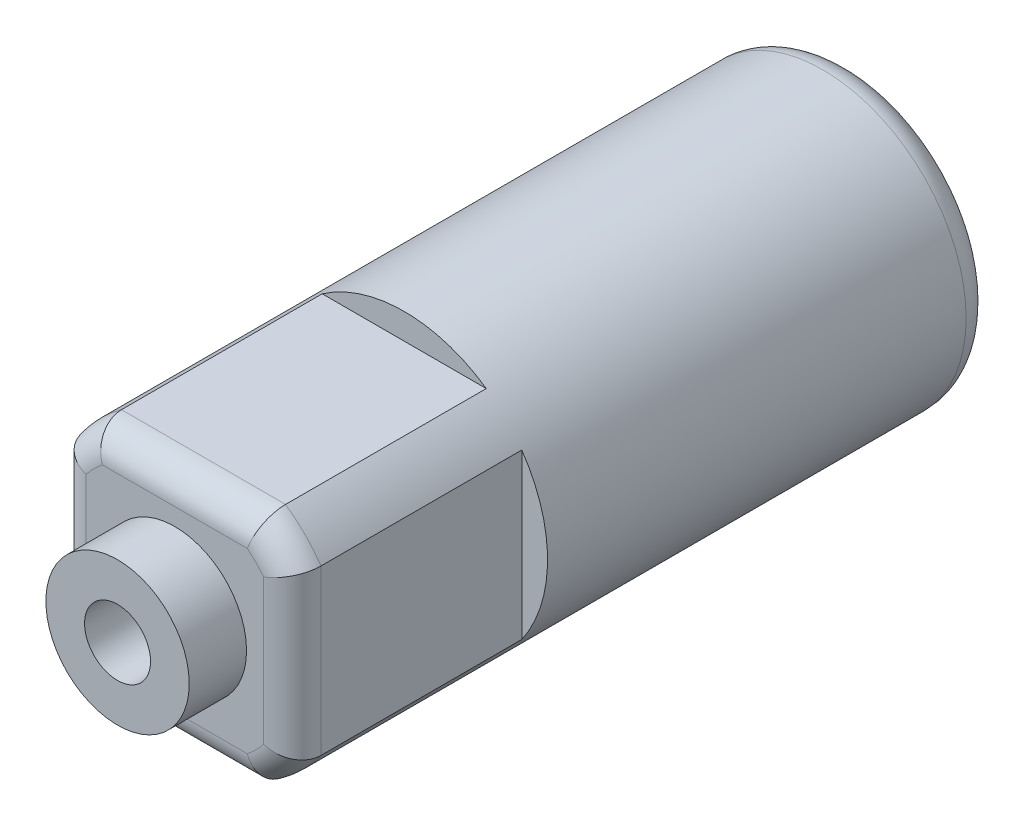
ISO-10303-21;
HEADER;
FILE_DESCRIPTION(('STEP AP214'),'2;1');
FILE_NAME('part.step','',(''),(''),'','','');
FILE_SCHEMA(('AUTOMOTIVE_DESIGN { 1 0 10303 214 1 1 1 1 }'));
ENDSEC;
DATA;
#1=APPLICATION_CONTEXT('core data for automotive mechanical design processes');
#2=APPLICATION_PROTOCOL_DEFINITION('international standard','automotive_design',2000,#1);
#3=PRODUCT_CONTEXT('',#1,'mechanical');
#4=PRODUCT('Part','Part','',(#3));
#5=PRODUCT_RELATED_PRODUCT_CATEGORY('part','',(#4));
#6=PRODUCT_DEFINITION_FORMATION('','',#4);
#7=PRODUCT_DEFINITION_CONTEXT('part definition',#1,'design');
#8=PRODUCT_DEFINITION('design','',#6,#7);
#9=PRODUCT_DEFINITION_SHAPE('','',#8);
#10=(LENGTH_UNIT() NAMED_UNIT(*) SI_UNIT(.MILLI.,.METRE.));
#11=(NAMED_UNIT(*) PLANE_ANGLE_UNIT() SI_UNIT($,.RADIAN.));
#12=(NAMED_UNIT(*) SI_UNIT($,.STERADIAN.) SOLID_ANGLE_UNIT());
#13=UNCERTAINTY_MEASURE_WITH_UNIT(LENGTH_MEASURE(1.E-05),#10,'distance_accuracy_value','');
#14=(GEOMETRIC_REPRESENTATION_CONTEXT(3) GLOBAL_UNCERTAINTY_ASSIGNED_CONTEXT((#13)) GLOBAL_UNIT_ASSIGNED_CONTEXT((#10,
#11,#12)) REPRESENTATION_CONTEXT('',''));
#15=CARTESIAN_POINT('',(0.,0.,0.));
#16=DIRECTION('',(0.,0.,1.));
#17=DIRECTION('',(1.,0.,0.));
#18=AXIS2_PLACEMENT_3D('',#15,#16,#17);
#19=CARTESIAN_POINT('',(0.,0.,23.6));
#20=DIRECTION('',(0.,0.,-1.));
#21=DIRECTION('',(-1.,0.,0.));
#22=AXIS2_PLACEMENT_3D('',#19,#20,#21);
#23=CYLINDRICAL_SURFACE('',#22,5.);
#24=CARTESIAN_POINT('',(0.,0.,1.));
#25=DIRECTION('',(0.,0.,1.));
#26=DIRECTION('',(1.,0.,0.));
#27=AXIS2_PLACEMENT_3D('',#24,#25,#26);
#28=CIRCLE('',#27,5.);
#29=CARTESIAN_POINT('',(5.,0.,1.));
#30=VERTEX_POINT('',#29);
#31=EDGE_CURVE('E183',#30,#30,#28,.T.);
#32=ORIENTED_EDGE('',*,*,#31,.T.);
#33=EDGE_LOOP('',(#32));
#34=FACE_BOUND('',#33,.T.);
#35=DIRECTION('',(0.,0.,-1.));
#36=VECTOR('',#35,1.);
#37=CARTESIAN_POINT('',(4.1,-2.86181760425084,23.6));
#38=LINE('',#37,#36);
#39=CARTESIAN_POINT('',(4.1,-2.86181760425084,15.6));
#40=VERTEX_POINT('',#39);
#41=CARTESIAN_POINT('',(4.1,-2.86181760425084,22.6));
#42=VERTEX_POINT('',#41);
#43=EDGE_CURVE('E137',#40,#42,#38,.F.);
#44=ORIENTED_EDGE('',*,*,#43,.T.);
#45=CARTESIAN_POINT('',(0.,0.,22.6));
#46=DIRECTION('',(0.,0.,1.));
#47=DIRECTION('',(1.,0.,0.));
#48=AXIS2_PLACEMENT_3D('',#45,#46,#47);
#49=CIRCLE('',#48,5.);
#50=CARTESIAN_POINT('',(2.86181760425084,-4.1,22.6));
#51=VERTEX_POINT('',#50);
#52=EDGE_CURVE('E134',#42,#51,#49,.F.);
#53=ORIENTED_EDGE('',*,*,#52,.T.);
#54=DIRECTION('',(0.,0.,-1.));
#55=VECTOR('',#54,1.);
#56=CARTESIAN_POINT('',(2.86181760425084,-4.1,23.6));
#57=LINE('',#56,#55);
#58=CARTESIAN_POINT('',(2.86181760425084,-4.1,15.6));
#59=VERTEX_POINT('',#58);
#60=EDGE_CURVE('E128',#51,#59,#57,.T.);
#61=ORIENTED_EDGE('',*,*,#60,.T.);
#62=CARTESIAN_POINT('',(0.,0.,15.6));
#63=DIRECTION('',(0.,0.,-1.));
#64=DIRECTION('',(-1.,0.,0.));
#65=AXIS2_PLACEMENT_3D('',#62,#63,#64);
#66=CIRCLE('',#65,5.);
#67=CARTESIAN_POINT('',(-2.86181760425084,-4.1,15.6));
#68=VERTEX_POINT('',#67);
#69=EDGE_CURVE('E132',#59,#68,#66,.T.);
#70=ORIENTED_EDGE('',*,*,#69,.T.);
#71=DIRECTION('',(0.,0.,-1.));
#72=VECTOR('',#71,1.);
#73=CARTESIAN_POINT('',(-2.86181760425084,-4.1,23.6));
#74=LINE('',#73,#72);
#75=CARTESIAN_POINT('',(-2.86181760425084,-4.1,22.6));
#76=VERTEX_POINT('',#75);
#77=EDGE_CURVE('E138',#68,#76,#74,.F.);
#78=ORIENTED_EDGE('',*,*,#77,.T.);
#79=CARTESIAN_POINT('',(0.,0.,22.6));
#80=DIRECTION('',(0.,0.,1.));
#81=DIRECTION('',(1.,0.,0.));
#82=AXIS2_PLACEMENT_3D('',#79,#80,#81);
#83=CIRCLE('',#82,5.);
#84=CARTESIAN_POINT('',(-4.1,-2.86181760425084,22.6));
#85=VERTEX_POINT('',#84);
#86=EDGE_CURVE('E180',#76,#85,#83,.F.);
#87=ORIENTED_EDGE('',*,*,#86,.T.);
#88=DIRECTION('',(0.,0.,-1.));
#89=VECTOR('',#88,1.);
#90=CARTESIAN_POINT('',(-4.1,-2.86181760425084,23.6));
#91=LINE('',#90,#89);
#92=CARTESIAN_POINT('',(-4.1,-2.86181760425084,15.6));
#93=VERTEX_POINT('',#92);
#94=EDGE_CURVE('E145',#85,#93,#91,.T.);
#95=ORIENTED_EDGE('',*,*,#94,.T.);
#96=CARTESIAN_POINT('',(-4.1,2.86181760425084,15.6));
#97=VERTEX_POINT('',#96);
#98=EDGE_CURVE('E147',#93,#97,#66,.T.);
#99=ORIENTED_EDGE('',*,*,#98,.T.);
#100=DIRECTION('',(0.,0.,-1.));
#101=VECTOR('',#100,1.);
#102=CARTESIAN_POINT('',(-4.1,2.86181760425084,23.6));
#103=LINE('',#102,#101);
#104=CARTESIAN_POINT('',(-4.1,2.86181760425084,22.6));
#105=VERTEX_POINT('',#104);
#106=EDGE_CURVE('E165',#97,#105,#103,.F.);
#107=ORIENTED_EDGE('',*,*,#106,.T.);
#108=CARTESIAN_POINT('',(0.,0.,22.6));
#109=DIRECTION('',(0.,0.,1.));
#110=DIRECTION('',(1.,0.,0.));
#111=AXIS2_PLACEMENT_3D('',#108,#109,#110);
#112=CIRCLE('',#111,5.);
#113=CARTESIAN_POINT('',(-2.86181760425084,4.1,22.6));
#114=VERTEX_POINT('',#113);
#115=EDGE_CURVE('E178',#105,#114,#112,.F.);
#116=ORIENTED_EDGE('',*,*,#115,.T.);
#117=DIRECTION('',(0.,0.,-1.));
#118=VECTOR('',#117,1.);
#119=CARTESIAN_POINT('',(-2.86181760425084,4.1,23.6));
#120=LINE('',#119,#118);
#121=CARTESIAN_POINT('',(-2.86181760425084,4.1,15.6));
#122=VERTEX_POINT('',#121);
#123=EDGE_CURVE('E163',#114,#122,#120,.T.);
#124=ORIENTED_EDGE('',*,*,#123,.T.);
#125=CARTESIAN_POINT('',(2.86181760425084,4.1,15.6));
#126=VERTEX_POINT('',#125);
#127=EDGE_CURVE('E314',#122,#126,#66,.T.);
#128=ORIENTED_EDGE('',*,*,#127,.T.);
#129=DIRECTION('',(0.,0.,-1.));
#130=VECTOR('',#129,1.);
#131=CARTESIAN_POINT('',(2.86181760425084,4.1,23.6));
#132=LINE('',#131,#130);
#133=CARTESIAN_POINT('',(2.86181760425084,4.1,22.6));
#134=VERTEX_POINT('',#133);
#135=EDGE_CURVE('E160',#126,#134,#132,.F.);
#136=ORIENTED_EDGE('',*,*,#135,.T.);
#137=CARTESIAN_POINT('',(0.,0.,22.6));
#138=DIRECTION('',(0.,0.,1.));
#139=DIRECTION('',(1.,0.,0.));
#140=AXIS2_PLACEMENT_3D('',#137,#138,#139);
#141=CIRCLE('',#140,5.);
#142=CARTESIAN_POINT('',(4.1,2.86181760425084,22.6));
#143=VERTEX_POINT('',#142);
#144=EDGE_CURVE('E176',#134,#143,#141,.F.);
#145=ORIENTED_EDGE('',*,*,#144,.T.);
#146=DIRECTION('',(0.,0.,-1.));
#147=VECTOR('',#146,1.);
#148=CARTESIAN_POINT('',(4.1,2.86181760425084,23.6));
#149=LINE('',#148,#147);
#150=CARTESIAN_POINT('',(4.1,2.86181760425084,15.6));
#151=VERTEX_POINT('',#150);
#152=EDGE_CURVE('E158',#143,#151,#149,.T.);
#153=ORIENTED_EDGE('',*,*,#152,.T.);
#154=EDGE_CURVE('E144',#151,#40,#66,.T.);
#155=ORIENTED_EDGE('',*,*,#154,.T.);
#156=EDGE_LOOP('',(#44,#53,#61,#70,#78,#87,#95,#99,#107,#116,#124,#128,#136,#145,#153,#155));
#157=FACE_BOUND('',#156,.T.);
#158=ADVANCED_FACE('F33',(#34,#157),#23,.T.);
#159=CARTESIAN_POINT('',(0.,0.,23.6));
#160=DIRECTION('',(0.,0.,1.));
#161=DIRECTION('',(1.,0.,0.));
#162=AXIS2_PLACEMENT_3D('',#159,#160,#161);
#163=PLANE('',#162);
#164=CARTESIAN_POINT('',(0.,0.,23.6));
#165=DIRECTION('',(0.,0.,1.));
#166=DIRECTION('',(1.,0.,0.));
#167=AXIS2_PLACEMENT_3D('',#164,#165,#166);
#168=CIRCLE('',#167,4.);
#169=CARTESIAN_POINT('',(-3.1,-2.52784493195291,23.6));
#170=VERTEX_POINT('',#169);
#171=CARTESIAN_POINT('',(-2.52784493195291,-3.1,23.6));
#172=VERTEX_POINT('',#171);
#173=EDGE_CURVE('E55',#170,#172,#168,.T.);
#174=ORIENTED_EDGE('',*,*,#173,.T.);
#175=DIRECTION('',(-1.,0.,0.));
#176=VECTOR('',#175,1.);
#177=CARTESIAN_POINT('',(2.86181760425084,-3.1,23.6));
#178=LINE('',#177,#176);
#179=CARTESIAN_POINT('',(2.52784493195291,-3.1,23.6));
#180=VERTEX_POINT('',#179);
#181=EDGE_CURVE('E202',#172,#180,#178,.F.);
#182=ORIENTED_EDGE('',*,*,#181,.T.);
#183=CARTESIAN_POINT('',(0.,0.,23.6));
#184=DIRECTION('',(0.,0.,1.));
#185=DIRECTION('',(1.,0.,0.));
#186=AXIS2_PLACEMENT_3D('',#183,#184,#185);
#187=CIRCLE('',#186,4.);
#188=CARTESIAN_POINT('',(3.1,-2.52784493195291,23.6));
#189=VERTEX_POINT('',#188);
#190=EDGE_CURVE('E193',#180,#189,#187,.T.);
#191=ORIENTED_EDGE('',*,*,#190,.T.);
#192=DIRECTION('',(0.,-1.,0.));
#193=VECTOR('',#192,1.);
#194=CARTESIAN_POINT('',(3.1,2.86181760425084,23.6));
#195=LINE('',#194,#193);
#196=CARTESIAN_POINT('',(3.1,2.52784493195291,23.6));
#197=VERTEX_POINT('',#196);
#198=EDGE_CURVE('E189',#189,#197,#195,.F.);
#199=ORIENTED_EDGE('',*,*,#198,.T.);
#200=CARTESIAN_POINT('',(0.,0.,23.6));
#201=DIRECTION('',(0.,0.,1.));
#202=DIRECTION('',(1.,0.,0.));
#203=AXIS2_PLACEMENT_3D('',#200,#201,#202);
#204=CIRCLE('',#203,4.);
#205=CARTESIAN_POINT('',(2.52784493195291,3.1,23.6));
#206=VERTEX_POINT('',#205);
#207=EDGE_CURVE('E191',#197,#206,#204,.T.);
#208=ORIENTED_EDGE('',*,*,#207,.T.);
#209=DIRECTION('',(1.,0.,0.));
#210=VECTOR('',#209,1.);
#211=CARTESIAN_POINT('',(-2.86181760425084,3.1,23.6));
#212=LINE('',#211,#210);
#213=CARTESIAN_POINT('',(-2.52784493195291,3.1,23.6));
#214=VERTEX_POINT('',#213);
#215=EDGE_CURVE('E196',#206,#214,#212,.F.);
#216=ORIENTED_EDGE('',*,*,#215,.T.);
#217=CARTESIAN_POINT('',(0.,0.,23.6));
#218=DIRECTION('',(0.,0.,1.));
#219=DIRECTION('',(1.,0.,0.));
#220=AXIS2_PLACEMENT_3D('',#217,#218,#219);
#221=CIRCLE('',#220,4.);
#222=CARTESIAN_POINT('',(-3.1,2.52784493195291,23.6));
#223=VERTEX_POINT('',#222);
#224=EDGE_CURVE('E198',#214,#223,#221,.T.);
#225=ORIENTED_EDGE('',*,*,#224,.T.);
#226=DIRECTION('',(0.,1.,0.));
#227=VECTOR('',#226,1.);
#228=CARTESIAN_POINT('',(-3.1,-2.86181760425084,23.6));
#229=LINE('',#228,#227);
#230=EDGE_CURVE('E60',#223,#170,#229,.F.);
#231=ORIENTED_EDGE('',*,*,#230,.T.);
#232=EDGE_LOOP('',(#174,#182,#191,#199,#208,#216,#225,#231));
#233=FACE_BOUND('',#232,.T.);
#234=CARTESIAN_POINT('',(0.,0.,23.6));
#235=DIRECTION('',(0.,0.,1.));
#236=DIRECTION('',(1.,0.,0.));
#237=AXIS2_PLACEMENT_3D('',#234,#235,#236);
#238=CIRCLE('',#237,2.5);
#239=CARTESIAN_POINT('',(2.5,0.,23.6));
#240=VERTEX_POINT('',#239);
#241=EDGE_CURVE('E173',#240,#240,#238,.T.);
#242=ORIENTED_EDGE('',*,*,#241,.F.);
#243=EDGE_LOOP('',(#242));
#244=FACE_BOUND('',#243,.T.);
#245=ADVANCED_FACE('F360',(#233,#244),#163,.T.);
#246=CARTESIAN_POINT('',(0.,0.,0.));
#247=DIRECTION('',(0.,0.,1.));
#248=DIRECTION('',(1.,0.,0.));
#249=AXIS2_PLACEMENT_3D('',#246,#247,#248);
#250=PLANE('',#249);
#251=CARTESIAN_POINT('',(0.,0.,0.));
#252=DIRECTION('',(0.,0.,1.));
#253=DIRECTION('',(1.,0.,0.));
#254=AXIS2_PLACEMENT_3D('',#251,#252,#253);
#255=CIRCLE('',#254,4.);
#256=CARTESIAN_POINT('',(4.,0.,0.));
#257=VERTEX_POINT('',#256);
#258=EDGE_CURVE('E186',#257,#257,#255,.F.);
#259=ORIENTED_EDGE('',*,*,#258,.T.);
#260=EDGE_LOOP('',(#259));
#261=FACE_BOUND('',#260,.T.);
#262=ADVANCED_FACE('F362',(#261),#250,.F.);
#263=CARTESIAN_POINT('',(4.1,-4.1,15.6));
#264=DIRECTION('',(0.,1.,0.));
#265=DIRECTION('',(0.,0.,1.));
#266=AXIS2_PLACEMENT_3D('',#263,#264,#265);
#267=PLANE('',#266);
#268=ORIENTED_EDGE('',*,*,#60,.F.);
#269=DIRECTION('',(-1.,0.,0.));
#270=VECTOR('',#269,1.);
#271=CARTESIAN_POINT('',(-2.86181760425084,-4.1,22.6));
#272=LINE('',#271,#270);
#273=EDGE_CURVE('E204',#51,#76,#272,.T.);
#274=ORIENTED_EDGE('',*,*,#273,.T.);
#275=ORIENTED_EDGE('',*,*,#77,.F.);
#276=DIRECTION('',(-1.,0.,0.));
#277=VECTOR('',#276,1.);
#278=CARTESIAN_POINT('',(4.1,-4.1,15.6));
#279=LINE('',#278,#277);
#280=EDGE_CURVE('E143',#59,#68,#279,.T.);
#281=ORIENTED_EDGE('',*,*,#280,.F.);
#282=EDGE_LOOP('',(#268,#274,#275,#281));
#283=FACE_BOUND('',#282,.T.);
#284=ADVANCED_FACE('F148',(#283),#267,.F.);
#285=CARTESIAN_POINT('',(0.,0.,15.6));
#286=DIRECTION('',(0.,0.,-1.));
#287=DIRECTION('',(-1.,0.,0.));
#288=AXIS2_PLACEMENT_3D('',#285,#286,#287);
#289=PLANE('',#288);
#290=ORIENTED_EDGE('',*,*,#280,.T.);
#291=ORIENTED_EDGE('',*,*,#69,.F.);
#292=EDGE_LOOP('',(#290,#291));
#293=FACE_BOUND('',#292,.T.);
#294=ADVANCED_FACE('F142',(#293),#289,.F.);
#295=CARTESIAN_POINT('',(4.1,-4.1,15.6));
#296=DIRECTION('',(-1.,0.,0.));
#297=DIRECTION('',(0.,0.,1.));
#298=AXIS2_PLACEMENT_3D('',#295,#296,#297);
#299=PLANE('',#298);
#300=ORIENTED_EDGE('',*,*,#152,.F.);
#301=DIRECTION('',(0.,-1.,0.));
#302=VECTOR('',#301,1.);
#303=CARTESIAN_POINT('',(4.1,-2.86181760425084,22.6));
#304=LINE('',#303,#302);
#305=EDGE_CURVE('E12',#143,#42,#304,.T.);
#306=ORIENTED_EDGE('',*,*,#305,.T.);
#307=ORIENTED_EDGE('',*,*,#43,.F.);
#308=DIRECTION('',(0.,-1.,0.));
#309=VECTOR('',#308,1.);
#310=CARTESIAN_POINT('',(4.1,-4.1,15.6));
#311=LINE('',#310,#309);
#312=EDGE_CURVE('E149',#151,#40,#311,.T.);
#313=ORIENTED_EDGE('',*,*,#312,.F.);
#314=EDGE_LOOP('',(#300,#306,#307,#313));
#315=FACE_BOUND('',#314,.T.);
#316=ADVANCED_FACE('F322',(#315),#299,.F.);
#317=ORIENTED_EDGE('',*,*,#312,.T.);
#318=ORIENTED_EDGE('',*,*,#154,.F.);
#319=EDGE_LOOP('',(#317,#318));
#320=FACE_BOUND('',#319,.T.);
#321=ADVANCED_FACE('F320',(#320),#289,.F.);
#322=CARTESIAN_POINT('',(4.1,4.1,15.6));
#323=DIRECTION('',(0.,-1.,0.));
#324=DIRECTION('',(0.,0.,-1.));
#325=AXIS2_PLACEMENT_3D('',#322,#323,#324);
#326=PLANE('',#325);
#327=ORIENTED_EDGE('',*,*,#123,.F.);
#328=DIRECTION('',(1.,0.,0.));
#329=VECTOR('',#328,1.);
#330=CARTESIAN_POINT('',(2.86181760425084,4.1,22.6));
#331=LINE('',#330,#329);
#332=EDGE_CURVE('E47',#114,#134,#331,.T.);
#333=ORIENTED_EDGE('',*,*,#332,.T.);
#334=ORIENTED_EDGE('',*,*,#135,.F.);
#335=DIRECTION('',(1.,0.,0.));
#336=VECTOR('',#335,1.);
#337=CARTESIAN_POINT('',(4.1,4.1,15.6));
#338=LINE('',#337,#336);
#339=EDGE_CURVE('E153',#122,#126,#338,.T.);
#340=ORIENTED_EDGE('',*,*,#339,.F.);
#341=EDGE_LOOP('',(#327,#333,#334,#340));
#342=FACE_BOUND('',#341,.T.);
#343=ADVANCED_FACE('F308',(#342),#326,.F.);
#344=ORIENTED_EDGE('',*,*,#339,.T.);
#345=ORIENTED_EDGE('',*,*,#127,.F.);
#346=EDGE_LOOP('',(#344,#345));
#347=FACE_BOUND('',#346,.T.);
#348=ADVANCED_FACE('F373',(#347),#289,.F.);
#349=DIRECTION('',(0.,1.,0.));
#350=VECTOR('',#349,1.);
#351=CARTESIAN_POINT('',(-4.1,-4.1,15.6));
#352=LINE('',#351,#350);
#353=EDGE_CURVE('E335',#93,#97,#352,.T.);
#354=ORIENTED_EDGE('',*,*,#353,.T.);
#355=ORIENTED_EDGE('',*,*,#98,.F.);
#356=EDGE_LOOP('',(#354,#355));
#357=FACE_BOUND('',#356,.T.);
#358=ADVANCED_FACE('F334',(#357),#289,.F.);
#359=CARTESIAN_POINT('',(-4.1,-4.1,15.6));
#360=DIRECTION('',(1.,0.,0.));
#361=DIRECTION('',(0.,0.,-1.));
#362=AXIS2_PLACEMENT_3D('',#359,#360,#361);
#363=PLANE('',#362);
#364=ORIENTED_EDGE('',*,*,#94,.F.);
#365=DIRECTION('',(0.,1.,0.));
#366=VECTOR('',#365,1.);
#367=CARTESIAN_POINT('',(-4.1,2.86181760425084,22.6));
#368=LINE('',#367,#366);
#369=EDGE_CURVE('E206',#85,#105,#368,.T.);
#370=ORIENTED_EDGE('',*,*,#369,.T.);
#371=ORIENTED_EDGE('',*,*,#106,.F.);
#372=ORIENTED_EDGE('',*,*,#353,.F.);
#373=EDGE_LOOP('',(#364,#370,#371,#372));
#374=FACE_BOUND('',#373,.T.);
#375=ADVANCED_FACE('F296',(#374),#363,.F.);
#376=CARTESIAN_POINT('',(0.,0.,25.6));
#377=DIRECTION('',(0.,0.,-1.));
#378=DIRECTION('',(-1.,0.,0.));
#379=AXIS2_PLACEMENT_3D('',#376,#377,#378);
#380=CYLINDRICAL_SURFACE('',#379,2.5);
#381=CARTESIAN_POINT('',(0.,0.,25.6));
#382=DIRECTION('',(0.,0.,1.));
#383=DIRECTION('',(1.,0.,0.));
#384=AXIS2_PLACEMENT_3D('',#381,#382,#383);
#385=CIRCLE('',#384,2.5);
#386=CARTESIAN_POINT('',(2.5,0.,25.6));
#387=VERTEX_POINT('',#386);
#388=EDGE_CURVE('E336',#387,#387,#385,.T.);
#389=ORIENTED_EDGE('',*,*,#388,.F.);
#390=EDGE_LOOP('',(#389));
#391=FACE_BOUND('',#390,.T.);
#392=ORIENTED_EDGE('',*,*,#241,.T.);
#393=EDGE_LOOP('',(#392));
#394=FACE_BOUND('',#393,.T.);
#395=ADVANCED_FACE('F351',(#391,#394),#380,.T.);
#396=CARTESIAN_POINT('',(0.,0.,25.6));
#397=DIRECTION('',(0.,0.,1.));
#398=DIRECTION('',(1.,0.,0.));
#399=AXIS2_PLACEMENT_3D('',#396,#397,#398);
#400=PLANE('',#399);
#401=CARTESIAN_POINT('',(0.,0.,25.6));
#402=DIRECTION('',(0.,0.,1.));
#403=DIRECTION('',(1.,0.,0.));
#404=AXIS2_PLACEMENT_3D('',#401,#402,#403);
#405=CIRCLE('',#404,1.15);
#406=CARTESIAN_POINT('',(1.15,0.,25.6));
#407=VERTEX_POINT('',#406);
#408=EDGE_CURVE('E286',#407,#407,#405,.T.);
#409=ORIENTED_EDGE('',*,*,#408,.F.);
#410=EDGE_LOOP('',(#409));
#411=FACE_BOUND('',#410,.T.);
#412=ORIENTED_EDGE('',*,*,#388,.T.);
#413=EDGE_LOOP('',(#412));
#414=FACE_BOUND('',#413,.T.);
#415=ADVANCED_FACE('F348',(#411,#414),#400,.T.);
#416=CARTESIAN_POINT('',(0.,0.,14.6));
#417=DIRECTION('',(0.,0.,1.));
#418=DIRECTION('',(1.,0.,0.));
#419=AXIS2_PLACEMENT_3D('',#416,#417,#418);
#420=CYLINDRICAL_SURFACE('',#419,1.15);
#421=CARTESIAN_POINT('',(0.,0.,15.6));
#422=DIRECTION('',(0.,0.,1.));
#423=DIRECTION('',(1.,0.,0.));
#424=AXIS2_PLACEMENT_3D('',#421,#422,#423);
#425=CIRCLE('',#424,1.15);
#426=CARTESIAN_POINT('',(1.15,0.,15.6));
#427=VERTEX_POINT('',#426);
#428=EDGE_CURVE('E172',#427,#427,#425,.F.);
#429=ORIENTED_EDGE('',*,*,#428,.T.);
#430=EDGE_LOOP('',(#429));
#431=FACE_BOUND('',#430,.T.);
#432=ORIENTED_EDGE('',*,*,#408,.T.);
#433=EDGE_LOOP('',(#432));
#434=FACE_BOUND('',#433,.T.);
#435=ADVANCED_FACE('F346',(#431,#434),#420,.F.);
#436=CARTESIAN_POINT('',(0.,0.,14.6));
#437=DIRECTION('',(0.,0.,1.));
#438=DIRECTION('',(1.,0.,0.));
#439=AXIS2_PLACEMENT_3D('',#436,#437,#438);
#440=PLANE('',#439);
#441=CARTESIAN_POINT('',(0.,0.,14.6));
#442=DIRECTION('',(0.,0.,1.));
#443=DIRECTION('',(1.,0.,0.));
#444=AXIS2_PLACEMENT_3D('',#441,#442,#443);
#445=CIRCLE('',#444,0.15);
#446=CARTESIAN_POINT('',(0.15,0.,14.6));
#447=VERTEX_POINT('',#446);
#448=EDGE_CURVE('E169',#447,#447,#445,.T.);
#449=ORIENTED_EDGE('',*,*,#448,.T.);
#450=EDGE_LOOP('',(#449));
#451=FACE_BOUND('',#450,.T.);
#452=ADVANCED_FACE('F379',(#451),#440,.T.);
#453=CARTESIAN_POINT('',(0.,0.,15.6));
#454=DIRECTION('',(0.,0.,1.));
#455=DIRECTION('',(1.,0.,0.));
#456=AXIS2_PLACEMENT_3D('',#453,#454,#455);
#457=DEGENERATE_TOROIDAL_SURFACE('',#456,0.15,1.,.T.);
#458=ORIENTED_EDGE('',*,*,#428,.F.);
#459=EDGE_LOOP('',(#458));
#460=FACE_BOUND('',#459,.T.);
#461=ORIENTED_EDGE('',*,*,#448,.F.);
#462=EDGE_LOOP('',(#461));
#463=FACE_BOUND('',#462,.T.);
#464=ADVANCED_FACE('F376',(#460,#463),#457,.F.);
#465=CARTESIAN_POINT('',(0.,0.,1.));
#466=DIRECTION('',(0.,0.,1.));
#467=DIRECTION('',(1.,0.,0.));
#468=AXIS2_PLACEMENT_3D('',#465,#466,#467);
#469=TOROIDAL_SURFACE('',#468,4.,1.);
#470=ORIENTED_EDGE('',*,*,#258,.F.);
#471=EDGE_LOOP('',(#470));
#472=FACE_BOUND('',#471,.T.);
#473=ORIENTED_EDGE('',*,*,#31,.F.);
#474=EDGE_LOOP('',(#473));
#475=FACE_BOUND('',#474,.T.);
#476=ADVANCED_FACE('F378',(#472,#475),#469,.T.);
#477=CARTESIAN_POINT('',(0.,0.,22.6));
#478=DIRECTION('',(0.,0.,1.));
#479=DIRECTION('',(1.,0.,0.));
#480=AXIS2_PLACEMENT_3D('',#477,#478,#479);
#481=TOROIDAL_SURFACE('',#480,4.,1.);
#482=CARTESIAN_POINT('',(-2.86181760425084,4.1,22.6));
#483=CARTESIAN_POINT('',(-2.86181754381553,4.10000046177195,22.6271677518521));
#484=CARTESIAN_POINT('',(-2.86146921460419,4.09889211822681,22.6543221749659));
#485=CARTESIAN_POINT('',(-2.86007961067067,4.09447481503274,22.7084299963281));
#486=CARTESIAN_POINT('',(-2.85903842762126,4.0911661465129,22.735383420694));
#487=CARTESIAN_POINT('',(-2.85488851549972,4.0779890499556,22.8155433674931));
#488=CARTESIAN_POINT('',(-2.85075337332471,4.06486931360432,22.8682017878048));
#489=CARTESIAN_POINT('',(-2.83985773348459,4.03042367778116,22.9704408958828));
#490=CARTESIAN_POINT('',(-2.83309706371142,4.00909724034603,23.0200213816378));
#491=CARTESIAN_POINT('',(-2.81712841407862,3.9589716318389,23.1148221684264));
#492=CARTESIAN_POINT('',(-2.80792016632315,3.93017164276911,23.1600419914316));
#493=CARTESIAN_POINT('',(-2.7871001770383,3.86545408433548,23.2457687310293));
#494=CARTESIAN_POINT('',(-2.77544787298001,3.82941689889108,23.2861752963155));
#495=CARTESIAN_POINT('',(-2.75012790373925,3.75169078565652,23.3603866845259));
#496=CARTESIAN_POINT('',(-2.73645960833823,3.71000009085389,23.3941894353242));
#497=CARTESIAN_POINT('',(-2.70678626889682,3.62025693578713,23.4558179978533));
#498=CARTESIAN_POINT('',(-2.69070515337854,3.57200594522239,23.4833176124662));
#499=CARTESIAN_POINT('',(-2.65706365808148,3.47205829395453,23.5298441453794));
#500=CARTESIAN_POINT('',(-2.63950324470725,3.42036155500264,23.5488708711953));
#501=CARTESIAN_POINT('',(-2.60680529786262,3.32512218303866,23.5753320987418));
#502=CARTESIAN_POINT('',(-2.59185359164907,3.28192965837449,23.5842945240204));
#503=CARTESIAN_POINT('',(-2.56147744886969,3.19496501116917,23.5964450751001));
#504=CARTESIAN_POINT('',(-2.54605395050984,3.15119412620187,23.5996439883005));
#505=CARTESIAN_POINT('',(-2.52962345276633,3.10499667130596,23.5999906598726));
#506=CARTESIAN_POINT('',(-2.52873437349047,3.10249818015746,23.6000000235239));
#507=CARTESIAN_POINT('',(-2.52784493195291,3.1,23.6));
#508=B_SPLINE_CURVE_WITH_KNOTS('',3,(#482,#483,#484,#485,#486,#487,#488,#489,#490,#491,#492,
#493,#494,#495,#496,#497,#498,#499,#500,#501,#502,#503,#504,#505,#506,#507),.UNSPECIFIED.,.F.,
.F.,(4,2,2,2,2,2,2,2,2,2,2,2,4),(0.,0.0814521164677968,0.162893457998911,0.325325403671738,
0.48776799884972,0.650228381256057,0.815635262282702,0.981093961138803,1.15379157910637,
1.32649312016438,1.46588963902794,1.60502498133526,1.61298084788939),.UNSPECIFIED.);
#509=EDGE_CURVE('E276',#114,#214,#508,.T.);
#510=ORIENTED_EDGE('',*,*,#509,.F.);
#511=ORIENTED_EDGE('',*,*,#115,.F.);
#512=CARTESIAN_POINT('',(-4.1,2.86181760425084,22.6));
#513=CARTESIAN_POINT('',(-4.10000046177195,2.86181754381553,22.6271677518521));
#514=CARTESIAN_POINT('',(-4.09889211822681,2.86146921460419,22.6543221749659));
#515=CARTESIAN_POINT('',(-4.09447481503274,2.86007961067067,22.7084299963281));
#516=CARTESIAN_POINT('',(-4.0911661465129,2.85903842762126,22.735383420694));
#517=CARTESIAN_POINT('',(-4.0779890499556,2.85488851549972,22.8155433674931));
#518=CARTESIAN_POINT('',(-4.06486931360432,2.85075337332471,22.8682017878048));
#519=CARTESIAN_POINT('',(-4.03042367778116,2.83985773348459,22.9704408958828));
#520=CARTESIAN_POINT('',(-4.00909724034603,2.83309706371142,23.0200213816378));
#521=CARTESIAN_POINT('',(-3.9589716318389,2.81712841407862,23.1148221684264));
#522=CARTESIAN_POINT('',(-3.93017164276911,2.80792016632315,23.1600419914316));
#523=CARTESIAN_POINT('',(-3.86545408433548,2.7871001770383,23.2457687310293));
#524=CARTESIAN_POINT('',(-3.82941689889108,2.77544787298001,23.2861752963155));
#525=CARTESIAN_POINT('',(-3.75169078565652,2.75012790373925,23.3603866845259));
#526=CARTESIAN_POINT('',(-3.71000009085389,2.73645960833823,23.3941894353242));
#527=CARTESIAN_POINT('',(-3.62025693578713,2.70678626889682,23.4558179978533));
#528=CARTESIAN_POINT('',(-3.57200594522239,2.69070515337854,23.4833176124662));
#529=CARTESIAN_POINT('',(-3.47205829395453,2.65706365808148,23.5298441453794));
#530=CARTESIAN_POINT('',(-3.42036155500264,2.63950324470725,23.5488708711953));
#531=CARTESIAN_POINT('',(-3.32512218303866,2.60680529786262,23.5753320987418));
#532=CARTESIAN_POINT('',(-3.28192965837449,2.59185359164907,23.5842945240204));
#533=CARTESIAN_POINT('',(-3.19496501116917,2.56147744886969,23.5964450751001));
#534=CARTESIAN_POINT('',(-3.15119412620187,2.54605395050984,23.5996439883005));
#535=CARTESIAN_POINT('',(-3.10499667130596,2.52962345276633,23.5999906598726));
#536=CARTESIAN_POINT('',(-3.10249818015746,2.52873437349047,23.6000000235239));
#537=CARTESIAN_POINT('',(-3.1,2.52784493195291,23.6));
#538=B_SPLINE_CURVE_WITH_KNOTS('',3,(#512,#513,#514,#515,#516,#517,#518,#519,#520,#521,#522,
#523,#524,#525,#526,#527,#528,#529,#530,#531,#532,#533,#534,#535,#536,#537),.UNSPECIFIED.,.F.,
.F.,(4,2,2,2,2,2,2,2,2,2,2,2,4),(0.,0.0814521164677968,0.162893457998911,0.325325403671738,
0.48776799884972,0.650228381256057,0.815635262282702,0.981093961138803,1.15379157910637,
1.32649312016438,1.46588963902794,1.60502498133526,1.61298084788939),.UNSPECIFIED.);
#539=EDGE_CURVE('E38',#223,#105,#538,.F.);
#540=ORIENTED_EDGE('',*,*,#539,.F.);
#541=ORIENTED_EDGE('',*,*,#224,.F.);
#542=EDGE_LOOP('',(#510,#511,#540,#541));
#543=FACE_BOUND('',#542,.T.);
#544=ADVANCED_FACE('F35',(#543),#481,.T.);
#545=CARTESIAN_POINT('',(-3.1,-4.1,22.6));
#546=DIRECTION('',(0.,-1.,0.));
#547=DIRECTION('',(0.,0.,-1.));
#548=AXIS2_PLACEMENT_3D('',#545,#546,#547);
#549=CYLINDRICAL_SURFACE('',#548,1.);
#550=ORIENTED_EDGE('',*,*,#539,.T.);
#551=ORIENTED_EDGE('',*,*,#369,.F.);
#552=CARTESIAN_POINT('',(-4.1,-2.86181760425084,22.6));
#553=CARTESIAN_POINT('',(-4.10000046177195,-2.86181754381553,22.6271677518521));
#554=CARTESIAN_POINT('',(-4.09889211822681,-2.86146921460419,22.6543221749659));
#555=CARTESIAN_POINT('',(-4.09447481503274,-2.86007961067067,22.7084299963281));
#556=CARTESIAN_POINT('',(-4.0911661465129,-2.85903842762126,22.735383420694));
#557=CARTESIAN_POINT('',(-4.0779890499556,-2.85488851549972,22.8155433674931));
#558=CARTESIAN_POINT('',(-4.06486931360432,-2.85075337332471,22.8682017878048));
#559=CARTESIAN_POINT('',(-4.03042367778116,-2.83985773348459,22.9704408958828));
#560=CARTESIAN_POINT('',(-4.00909724034603,-2.83309706371142,23.0200213816378));
#561=CARTESIAN_POINT('',(-3.9589716318389,-2.81712841407862,23.1148221684264));
#562=CARTESIAN_POINT('',(-3.93017164276911,-2.80792016632315,23.1600419914316));
#563=CARTESIAN_POINT('',(-3.86545408433548,-2.7871001770383,23.2457687310293));
#564=CARTESIAN_POINT('',(-3.82941689889108,-2.77544787298001,23.2861752963155));
#565=CARTESIAN_POINT('',(-3.75169078565652,-2.75012790373925,23.3603866845259));
#566=CARTESIAN_POINT('',(-3.71000009085389,-2.73645960833823,23.3941894353242));
#567=CARTESIAN_POINT('',(-3.62025693578713,-2.70678626889682,23.4558179978533));
#568=CARTESIAN_POINT('',(-3.57200594522239,-2.69070515337854,23.4833176124662));
#569=CARTESIAN_POINT('',(-3.47205829395453,-2.65706365808148,23.5298441453794));
#570=CARTESIAN_POINT('',(-3.42036155500264,-2.63950324470725,23.5488708711953));
#571=CARTESIAN_POINT('',(-3.32512218303866,-2.60680529786262,23.5753320987418));
#572=CARTESIAN_POINT('',(-3.28192965837449,-2.59185359164907,23.5842945240204));
#573=CARTESIAN_POINT('',(-3.19496501116917,-2.56147744886969,23.5964450751001));
#574=CARTESIAN_POINT('',(-3.15119412620187,-2.54605395050984,23.5996439883005));
#575=CARTESIAN_POINT('',(-3.10499667130596,-2.52962345276633,23.5999906598726));
#576=CARTESIAN_POINT('',(-3.10249818015746,-2.52873437349047,23.6000000235239));
#577=CARTESIAN_POINT('',(-3.1,-2.52784493195291,23.6));
#578=B_SPLINE_CURVE_WITH_KNOTS('',3,(#552,#553,#554,#555,#556,#557,#558,#559,#560,#561,#562,
#563,#564,#565,#566,#567,#568,#569,#570,#571,#572,#573,#574,#575,#576,#577),.UNSPECIFIED.,.F.,
.F.,(4,2,2,2,2,2,2,2,2,2,2,2,4),(0.,0.0814521164677968,0.162893457998911,0.325325403671738,
0.48776799884972,0.650228381256057,0.815635262282702,0.981093961138803,1.15379157910637,
1.32649312016438,1.46588963902794,1.60502498133526,1.61298084788939),.UNSPECIFIED.);
#579=EDGE_CURVE('E264',#170,#85,#578,.F.);
#580=ORIENTED_EDGE('',*,*,#579,.F.);
#581=ORIENTED_EDGE('',*,*,#230,.F.);
#582=EDGE_LOOP('',(#550,#551,#580,#581));
#583=FACE_BOUND('',#582,.T.);
#584=ADVANCED_FACE('F272',(#583),#549,.T.);
#585=CARTESIAN_POINT('',(4.1,3.1,22.6));
#586=DIRECTION('',(-1.,0.,0.));
#587=DIRECTION('',(0.,0.,1.));
#588=AXIS2_PLACEMENT_3D('',#585,#586,#587);
#589=CYLINDRICAL_SURFACE('',#588,1.);
#590=ORIENTED_EDGE('',*,*,#509,.T.);
#591=ORIENTED_EDGE('',*,*,#215,.F.);
#592=CARTESIAN_POINT('',(2.86181760425084,4.1,22.6));
#593=CARTESIAN_POINT('',(2.86181754381553,4.10000046177195,22.6271677518521));
#594=CARTESIAN_POINT('',(2.86146921460419,4.09889211822681,22.6543221749659));
#595=CARTESIAN_POINT('',(2.86007961067067,4.09447481503274,22.7084299963281));
#596=CARTESIAN_POINT('',(2.85903842762126,4.0911661465129,22.735383420694));
#597=CARTESIAN_POINT('',(2.85488851549972,4.0779890499556,22.8155433674931));
#598=CARTESIAN_POINT('',(2.85075337332471,4.06486931360432,22.8682017878048));
#599=CARTESIAN_POINT('',(2.83985773348459,4.03042367778116,22.9704408958828));
#600=CARTESIAN_POINT('',(2.83309706371142,4.00909724034603,23.0200213816378));
#601=CARTESIAN_POINT('',(2.81712841407862,3.9589716318389,23.1148221684264));
#602=CARTESIAN_POINT('',(2.80792016632315,3.93017164276911,23.1600419914316));
#603=CARTESIAN_POINT('',(2.7871001770383,3.86545408433548,23.2457687310293));
#604=CARTESIAN_POINT('',(2.77544787298001,3.82941689889108,23.2861752963155));
#605=CARTESIAN_POINT('',(2.75012790373925,3.75169078565652,23.3603866845259));
#606=CARTESIAN_POINT('',(2.73645960833823,3.71000009085389,23.3941894353242));
#607=CARTESIAN_POINT('',(2.70678626889682,3.62025693578713,23.4558179978533));
#608=CARTESIAN_POINT('',(2.69070515337854,3.57200594522239,23.4833176124662));
#609=CARTESIAN_POINT('',(2.65706365808148,3.47205829395453,23.5298441453794));
#610=CARTESIAN_POINT('',(2.63950324470725,3.42036155500264,23.5488708711953));
#611=CARTESIAN_POINT('',(2.60680529786262,3.32512218303866,23.5753320987418));
#612=CARTESIAN_POINT('',(2.59185359164907,3.28192965837449,23.5842945240204));
#613=CARTESIAN_POINT('',(2.56147744886969,3.19496501116917,23.5964450751001));
#614=CARTESIAN_POINT('',(2.54605395050984,3.15119412620187,23.5996439883005));
#615=CARTESIAN_POINT('',(2.52962345276633,3.10499667130596,23.5999906598726));
#616=CARTESIAN_POINT('',(2.52873437349047,3.10249818015746,23.6000000235239));
#617=CARTESIAN_POINT('',(2.52784493195291,3.1,23.6));
#618=B_SPLINE_CURVE_WITH_KNOTS('',3,(#592,#593,#594,#595,#596,#597,#598,#599,#600,#601,#602,
#603,#604,#605,#606,#607,#608,#609,#610,#611,#612,#613,#614,#615,#616,#617),.UNSPECIFIED.,.F.,
.F.,(4,2,2,2,2,2,2,2,2,2,2,2,4),(0.,0.0814521164677968,0.162893457998911,0.325325403671738,
0.48776799884972,0.650228381256057,0.815635262282702,0.981093961138803,1.15379157910637,
1.32649312016438,1.46588963902794,1.60502498133526,1.61298084788939),.UNSPECIFIED.);
#619=EDGE_CURVE('E257',#134,#206,#618,.T.);
#620=ORIENTED_EDGE('',*,*,#619,.F.);
#621=ORIENTED_EDGE('',*,*,#332,.F.);
#622=EDGE_LOOP('',(#590,#591,#620,#621));
#623=FACE_BOUND('',#622,.T.);
#624=ADVANCED_FACE('F269',(#623),#589,.T.);
#625=CARTESIAN_POINT('',(0.,0.,22.6));
#626=DIRECTION('',(0.,0.,1.));
#627=DIRECTION('',(1.,0.,0.));
#628=AXIS2_PLACEMENT_3D('',#625,#626,#627);
#629=TOROIDAL_SURFACE('',#628,4.,1.);
#630=ORIENTED_EDGE('',*,*,#579,.T.);
#631=ORIENTED_EDGE('',*,*,#86,.F.);
#632=CARTESIAN_POINT('',(-2.86181760425084,-4.1,22.6));
#633=CARTESIAN_POINT('',(-2.86181754381553,-4.10000046177195,22.6271677518521));
#634=CARTESIAN_POINT('',(-2.86146921460419,-4.09889211822681,22.6543221749659));
#635=CARTESIAN_POINT('',(-2.86007961067067,-4.09447481503274,22.7084299963281));
#636=CARTESIAN_POINT('',(-2.85903842762126,-4.0911661465129,22.735383420694));
#637=CARTESIAN_POINT('',(-2.85488851549972,-4.0779890499556,22.8155433674931));
#638=CARTESIAN_POINT('',(-2.85075337332471,-4.06486931360432,22.8682017878048));
#639=CARTESIAN_POINT('',(-2.83985773348459,-4.03042367778116,22.9704408958828));
#640=CARTESIAN_POINT('',(-2.83309706371142,-4.00909724034603,23.0200213816378));
#641=CARTESIAN_POINT('',(-2.81712841407862,-3.9589716318389,23.1148221684264));
#642=CARTESIAN_POINT('',(-2.80792016632315,-3.93017164276911,23.1600419914316));
#643=CARTESIAN_POINT('',(-2.7871001770383,-3.86545408433548,23.2457687310293));
#644=CARTESIAN_POINT('',(-2.77544787298001,-3.82941689889108,23.2861752963155));
#645=CARTESIAN_POINT('',(-2.75012790373925,-3.75169078565652,23.3603866845259));
#646=CARTESIAN_POINT('',(-2.73645960833823,-3.71000009085389,23.3941894353242));
#647=CARTESIAN_POINT('',(-2.70678626889682,-3.62025693578713,23.4558179978533));
#648=CARTESIAN_POINT('',(-2.69070515337854,-3.57200594522239,23.4833176124662));
#649=CARTESIAN_POINT('',(-2.65706365808148,-3.47205829395453,23.5298441453794));
#650=CARTESIAN_POINT('',(-2.63950324470725,-3.42036155500264,23.5488708711953));
#651=CARTESIAN_POINT('',(-2.60680529786262,-3.32512218303866,23.5753320987418));
#652=CARTESIAN_POINT('',(-2.59185359164907,-3.28192965837449,23.5842945240204));
#653=CARTESIAN_POINT('',(-2.56147744886969,-3.19496501116917,23.5964450751001));
#654=CARTESIAN_POINT('',(-2.54605395050984,-3.15119412620187,23.5996439883005));
#655=CARTESIAN_POINT('',(-2.52962345276633,-3.10499667130596,23.5999906598726));
#656=CARTESIAN_POINT('',(-2.52873437349047,-3.10249818015746,23.6000000235239));
#657=CARTESIAN_POINT('',(-2.52784493195291,-3.1,23.6));
#658=B_SPLINE_CURVE_WITH_KNOTS('',3,(#632,#633,#634,#635,#636,#637,#638,#639,#640,#641,#642,
#643,#644,#645,#646,#647,#648,#649,#650,#651,#652,#653,#654,#655,#656,#657),.UNSPECIFIED.,.F.,
.F.,(4,2,2,2,2,2,2,2,2,2,2,2,4),(0.,0.0814521164677968,0.162893457998911,0.325325403671738,
0.48776799884972,0.650228381256057,0.815635262282702,0.981093961138803,1.15379157910637,
1.32649312016438,1.46588963902794,1.60502498133526,1.61298084788939),.UNSPECIFIED.);
#659=EDGE_CURVE('E242',#172,#76,#658,.F.);
#660=ORIENTED_EDGE('',*,*,#659,.F.);
#661=ORIENTED_EDGE('',*,*,#173,.F.);
#662=EDGE_LOOP('',(#630,#631,#660,#661));
#663=FACE_BOUND('',#662,.T.);
#664=ADVANCED_FACE('F252',(#663),#629,.T.);
#665=CARTESIAN_POINT('',(0.,0.,22.6));
#666=DIRECTION('',(0.,0.,1.));
#667=DIRECTION('',(1.,0.,0.));
#668=AXIS2_PLACEMENT_3D('',#665,#666,#667);
#669=TOROIDAL_SURFACE('',#668,4.,1.);
#670=ORIENTED_EDGE('',*,*,#619,.T.);
#671=ORIENTED_EDGE('',*,*,#207,.F.);
#672=CARTESIAN_POINT('',(4.1,2.86181760425084,22.6));
#673=CARTESIAN_POINT('',(4.10000046177195,2.86181754381553,22.6271677518521));
#674=CARTESIAN_POINT('',(4.09889211822681,2.86146921460419,22.6543221749659));
#675=CARTESIAN_POINT('',(4.09447481503274,2.86007961067067,22.7084299963281));
#676=CARTESIAN_POINT('',(4.0911661465129,2.85903842762126,22.735383420694));
#677=CARTESIAN_POINT('',(4.0779890499556,2.85488851549972,22.8155433674931));
#678=CARTESIAN_POINT('',(4.06486931360432,2.85075337332471,22.8682017878048));
#679=CARTESIAN_POINT('',(4.03042367778116,2.83985773348459,22.9704408958828));
#680=CARTESIAN_POINT('',(4.00909724034603,2.83309706371142,23.0200213816378));
#681=CARTESIAN_POINT('',(3.9589716318389,2.81712841407862,23.1148221684264));
#682=CARTESIAN_POINT('',(3.93017164276911,2.80792016632315,23.1600419914316));
#683=CARTESIAN_POINT('',(3.86545408433548,2.7871001770383,23.2457687310293));
#684=CARTESIAN_POINT('',(3.82941689889108,2.77544787298001,23.2861752963155));
#685=CARTESIAN_POINT('',(3.75169078565652,2.75012790373925,23.3603866845259));
#686=CARTESIAN_POINT('',(3.71000009085389,2.73645960833823,23.3941894353242));
#687=CARTESIAN_POINT('',(3.62025693578713,2.70678626889682,23.4558179978533));
#688=CARTESIAN_POINT('',(3.57200594522239,2.69070515337854,23.4833176124662));
#689=CARTESIAN_POINT('',(3.47205829395453,2.65706365808148,23.5298441453794));
#690=CARTESIAN_POINT('',(3.42036155500264,2.63950324470725,23.5488708711953));
#691=CARTESIAN_POINT('',(3.32512218303866,2.60680529786262,23.5753320987418));
#692=CARTESIAN_POINT('',(3.28192965837449,2.59185359164907,23.5842945240204));
#693=CARTESIAN_POINT('',(3.19496501116917,2.56147744886969,23.5964450751001));
#694=CARTESIAN_POINT('',(3.15119412620187,2.54605395050984,23.5996439883005));
#695=CARTESIAN_POINT('',(3.10499667130596,2.52962345276633,23.5999906598726));
#696=CARTESIAN_POINT('',(3.10249818015746,2.52873437349047,23.6000000235239));
#697=CARTESIAN_POINT('',(3.1,2.52784493195291,23.6));
#698=B_SPLINE_CURVE_WITH_KNOTS('',3,(#672,#673,#674,#675,#676,#677,#678,#679,#680,#681,#682,
#683,#684,#685,#686,#687,#688,#689,#690,#691,#692,#693,#694,#695,#696,#697),.UNSPECIFIED.,.F.,
.F.,(4,2,2,2,2,2,2,2,2,2,2,2,4),(0.,0.0814521164677968,0.162893457998911,0.325325403671738,
0.48776799884972,0.650228381256057,0.815635262282702,0.981093961138803,1.15379157910637,
1.32649312016438,1.46588963902794,1.60502498133526,1.61298084788939),.UNSPECIFIED.);
#699=EDGE_CURVE('E235',#143,#197,#698,.T.);
#700=ORIENTED_EDGE('',*,*,#699,.F.);
#701=ORIENTED_EDGE('',*,*,#144,.F.);
#702=EDGE_LOOP('',(#670,#671,#700,#701));
#703=FACE_BOUND('',#702,.T.);
#704=ADVANCED_FACE('F249',(#703),#669,.T.);
#705=CARTESIAN_POINT('',(4.1,-3.1,22.6));
#706=DIRECTION('',(1.,0.,0.));
#707=DIRECTION('',(0.,0.,-1.));
#708=AXIS2_PLACEMENT_3D('',#705,#706,#707);
#709=CYLINDRICAL_SURFACE('',#708,1.);
#710=ORIENTED_EDGE('',*,*,#659,.T.);
#711=ORIENTED_EDGE('',*,*,#273,.F.);
#712=CARTESIAN_POINT('',(2.86181760425084,-4.1,22.6));
#713=CARTESIAN_POINT('',(2.86181754381553,-4.10000046177195,22.6271677518521));
#714=CARTESIAN_POINT('',(2.86146921460419,-4.09889211822681,22.6543221749659));
#715=CARTESIAN_POINT('',(2.86007961067067,-4.09447481503274,22.7084299963281));
#716=CARTESIAN_POINT('',(2.85903842762126,-4.0911661465129,22.735383420694));
#717=CARTESIAN_POINT('',(2.85488851549972,-4.0779890499556,22.8155433674931));
#718=CARTESIAN_POINT('',(2.85075337332471,-4.06486931360432,22.8682017878048));
#719=CARTESIAN_POINT('',(2.83985773348459,-4.03042367778116,22.9704408958828));
#720=CARTESIAN_POINT('',(2.83309706371142,-4.00909724034603,23.0200213816378));
#721=CARTESIAN_POINT('',(2.81712841407862,-3.9589716318389,23.1148221684264));
#722=CARTESIAN_POINT('',(2.80792016632315,-3.93017164276911,23.1600419914316));
#723=CARTESIAN_POINT('',(2.7871001770383,-3.86545408433548,23.2457687310293));
#724=CARTESIAN_POINT('',(2.77544787298001,-3.82941689889108,23.2861752963155));
#725=CARTESIAN_POINT('',(2.75012790373925,-3.75169078565652,23.3603866845259));
#726=CARTESIAN_POINT('',(2.73645960833823,-3.71000009085389,23.3941894353242));
#727=CARTESIAN_POINT('',(2.70678626889682,-3.62025693578713,23.4558179978533));
#728=CARTESIAN_POINT('',(2.69070515337854,-3.57200594522239,23.4833176124662));
#729=CARTESIAN_POINT('',(2.65706365808148,-3.47205829395453,23.5298441453794));
#730=CARTESIAN_POINT('',(2.63950324470725,-3.42036155500264,23.5488708711953));
#731=CARTESIAN_POINT('',(2.60680529786262,-3.32512218303866,23.5753320987418));
#732=CARTESIAN_POINT('',(2.59185359164907,-3.28192965837449,23.5842945240204));
#733=CARTESIAN_POINT('',(2.56147744886969,-3.19496501116917,23.5964450751001));
#734=CARTESIAN_POINT('',(2.54605395050984,-3.15119412620187,23.5996439883005));
#735=CARTESIAN_POINT('',(2.52962345276633,-3.10499667130596,23.5999906598726));
#736=CARTESIAN_POINT('',(2.52873437349047,-3.10249818015746,23.6000000235239));
#737=CARTESIAN_POINT('',(2.52784493195291,-3.1,23.6));
#738=B_SPLINE_CURVE_WITH_KNOTS('',3,(#712,#713,#714,#715,#716,#717,#718,#719,#720,#721,#722,
#723,#724,#725,#726,#727,#728,#729,#730,#731,#732,#733,#734,#735,#736,#737),.UNSPECIFIED.,.F.,
.F.,(4,2,2,2,2,2,2,2,2,2,2,2,4),(0.,0.0814521164677968,0.162893457998911,0.325325403671738,
0.48776799884972,0.650228381256057,0.815635262282702,0.981093961138803,1.15379157910637,
1.32649312016438,1.46588963902794,1.60502498133526,1.61298084788939),.UNSPECIFIED.);
#739=EDGE_CURVE('E217',#180,#51,#738,.F.);
#740=ORIENTED_EDGE('',*,*,#739,.F.);
#741=ORIENTED_EDGE('',*,*,#181,.F.);
#742=EDGE_LOOP('',(#710,#711,#740,#741));
#743=FACE_BOUND('',#742,.T.);
#744=ADVANCED_FACE('F230',(#743),#709,.T.);
#745=CARTESIAN_POINT('',(3.1,-4.1,22.6));
#746=DIRECTION('',(0.,1.,0.));
#747=DIRECTION('',(0.,0.,1.));
#748=AXIS2_PLACEMENT_3D('',#745,#746,#747);
#749=CYLINDRICAL_SURFACE('',#748,1.);
#750=ORIENTED_EDGE('',*,*,#699,.T.);
#751=ORIENTED_EDGE('',*,*,#198,.F.);
#752=CARTESIAN_POINT('',(4.1,-2.86181760425084,22.6));
#753=CARTESIAN_POINT('',(4.10000046177195,-2.86181754381553,22.6271677518521));
#754=CARTESIAN_POINT('',(4.09889211822681,-2.86146921460419,22.6543221749659));
#755=CARTESIAN_POINT('',(4.09447481503274,-2.86007961067067,22.7084299963281));
#756=CARTESIAN_POINT('',(4.0911661465129,-2.85903842762126,22.735383420694));
#757=CARTESIAN_POINT('',(4.0779890499556,-2.85488851549972,22.8155433674931));
#758=CARTESIAN_POINT('',(4.06486931360432,-2.85075337332471,22.8682017878048));
#759=CARTESIAN_POINT('',(4.03042367778116,-2.83985773348459,22.9704408958828));
#760=CARTESIAN_POINT('',(4.00909724034603,-2.83309706371142,23.0200213816378));
#761=CARTESIAN_POINT('',(3.9589716318389,-2.81712841407862,23.1148221684264));
#762=CARTESIAN_POINT('',(3.93017164276911,-2.80792016632315,23.1600419914316));
#763=CARTESIAN_POINT('',(3.86545408433548,-2.7871001770383,23.2457687310293));
#764=CARTESIAN_POINT('',(3.82941689889108,-2.77544787298001,23.2861752963155));
#765=CARTESIAN_POINT('',(3.75169078565652,-2.75012790373925,23.3603866845259));
#766=CARTESIAN_POINT('',(3.71000009085389,-2.73645960833823,23.3941894353242));
#767=CARTESIAN_POINT('',(3.62025693578713,-2.70678626889682,23.4558179978533));
#768=CARTESIAN_POINT('',(3.57200594522239,-2.69070515337854,23.4833176124662));
#769=CARTESIAN_POINT('',(3.47205829395453,-2.65706365808148,23.5298441453794));
#770=CARTESIAN_POINT('',(3.42036155500264,-2.63950324470725,23.5488708711953));
#771=CARTESIAN_POINT('',(3.32512218303866,-2.60680529786262,23.5753320987418));
#772=CARTESIAN_POINT('',(3.28192965837449,-2.59185359164907,23.5842945240204));
#773=CARTESIAN_POINT('',(3.19496501116917,-2.56147744886969,23.5964450751001));
#774=CARTESIAN_POINT('',(3.15119412620187,-2.54605395050984,23.5996439883005));
#775=CARTESIAN_POINT('',(3.10499667130596,-2.52962345276633,23.5999906598726));
#776=CARTESIAN_POINT('',(3.10249818015746,-2.52873437349047,23.6000000235239));
#777=CARTESIAN_POINT('',(3.1,-2.52784493195291,23.6));
#778=B_SPLINE_CURVE_WITH_KNOTS('',3,(#752,#753,#754,#755,#756,#757,#758,#759,#760,#761,#762,
#763,#764,#765,#766,#767,#768,#769,#770,#771,#772,#773,#774,#775,#776,#777),.UNSPECIFIED.,.F.,
.F.,(4,2,2,2,2,2,2,2,2,2,2,2,4),(0.,0.0814521164677968,0.162893457998911,0.325325403671738,
0.48776799884972,0.650228381256057,0.815635262282702,0.981093961138803,1.15379157910637,
1.32649312016438,1.46588963902794,1.60502498133526,1.61298084788939),.UNSPECIFIED.);
#779=EDGE_CURVE('E209',#42,#189,#778,.T.);
#780=ORIENTED_EDGE('',*,*,#779,.F.);
#781=ORIENTED_EDGE('',*,*,#305,.F.);
#782=EDGE_LOOP('',(#750,#751,#780,#781));
#783=FACE_BOUND('',#782,.T.);
#784=ADVANCED_FACE('F227',(#783),#749,.T.);
#785=CARTESIAN_POINT('',(0.,0.,22.6));
#786=DIRECTION('',(0.,0.,1.));
#787=DIRECTION('',(1.,0.,0.));
#788=AXIS2_PLACEMENT_3D('',#785,#786,#787);
#789=TOROIDAL_SURFACE('',#788,4.,1.);
#790=ORIENTED_EDGE('',*,*,#739,.T.);
#791=ORIENTED_EDGE('',*,*,#52,.F.);
#792=ORIENTED_EDGE('',*,*,#779,.T.);
#793=ORIENTED_EDGE('',*,*,#190,.F.);
#794=EDGE_LOOP('',(#790,#791,#792,#793));
#795=FACE_BOUND('',#794,.T.);
#796=ADVANCED_FACE('F224',(#795),#789,.T.);
#797=CLOSED_SHELL('',(#158,#245,#262,#284,#294,#316,#321,#343,#348,#358,#375,#395,#415,#435,
#452,#464,#476,#544,#584,#624,#664,#704,#744,#784,#796));
#798=MANIFOLD_SOLID_BREP('B2',#797);
#799=ADVANCED_BREP_SHAPE_REPRESENTATION('',(#18,#798),#14);
#800=SHAPE_DEFINITION_REPRESENTATION(#9,#799);
ENDSEC;
END-ISO-10303-21;
